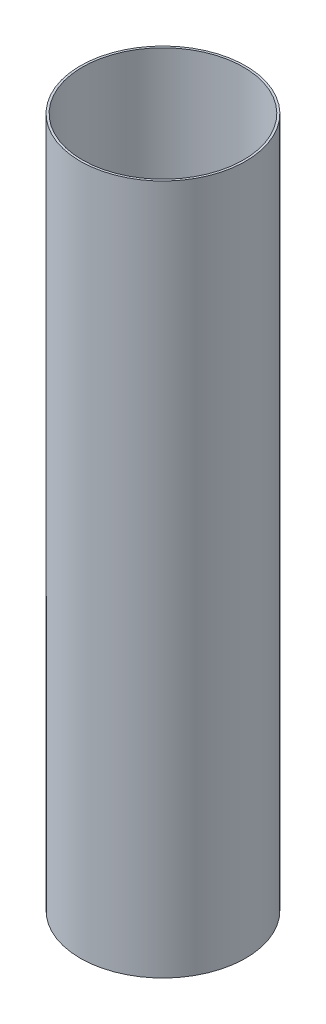
ISO-10303-21;
HEADER;
FILE_DESCRIPTION(('STEP AP214'),'2;1');
FILE_NAME('part.step','',(''),(''),'','','');
FILE_SCHEMA(('AUTOMOTIVE_DESIGN { 1 0 10303 214 1 1 1 1 }'));
ENDSEC;
DATA;
#1=APPLICATION_CONTEXT('core data for automotive mechanical design processes');
#2=APPLICATION_PROTOCOL_DEFINITION('international standard','automotive_design',2000,#1);
#3=PRODUCT_CONTEXT('',#1,'mechanical');
#4=PRODUCT('Part','Part','',(#3));
#5=PRODUCT_RELATED_PRODUCT_CATEGORY('part','',(#4));
#6=PRODUCT_DEFINITION_FORMATION('','',#4);
#7=PRODUCT_DEFINITION_CONTEXT('part definition',#1,'design');
#8=PRODUCT_DEFINITION('design','',#6,#7);
#9=PRODUCT_DEFINITION_SHAPE('','',#8);
#10=(LENGTH_UNIT() NAMED_UNIT(*) SI_UNIT(.MILLI.,.METRE.));
#11=(NAMED_UNIT(*) PLANE_ANGLE_UNIT() SI_UNIT($,.RADIAN.));
#12=(NAMED_UNIT(*) SI_UNIT($,.STERADIAN.) SOLID_ANGLE_UNIT());
#13=UNCERTAINTY_MEASURE_WITH_UNIT(LENGTH_MEASURE(1.E-05),#10,'distance_accuracy_value','');
#14=(GEOMETRIC_REPRESENTATION_CONTEXT(3) GLOBAL_UNCERTAINTY_ASSIGNED_CONTEXT((#13)) GLOBAL_UNIT_ASSIGNED_CONTEXT((#10,
#11,#12)) REPRESENTATION_CONTEXT('',''));
#15=CARTESIAN_POINT('',(0.,0.,0.));
#16=DIRECTION('',(0.,0.,1.));
#17=DIRECTION('',(1.,0.,0.));
#18=AXIS2_PLACEMENT_3D('',#15,#16,#17);
#19=CARTESIAN_POINT('',(0.,9144.,0.));
#20=DIRECTION('',(0.,1.,0.));
#21=DIRECTION('',(0.,0.,1.));
#22=AXIS2_PLACEMENT_3D('',#19,#20,#21);
#23=PLANE('',#22);
#24=CARTESIAN_POINT('',(0.,9144.,0.));
#25=DIRECTION('',(0.,1.,0.));
#26=DIRECTION('',(0.,0.,1.));
#27=AXIS2_PLACEMENT_3D('',#24,#25,#26);
#28=CIRCLE('',#27,1095.375);
#29=CARTESIAN_POINT('',(0.,9144.,1095.375));
#30=VERTEX_POINT('',#29);
#31=EDGE_CURVE('E10',#30,#30,#28,.T.);
#32=ORIENTED_EDGE('',*,*,#31,.T.);
#33=EDGE_LOOP('',(#32));
#34=FACE_BOUND('',#33,.T.);
#35=CARTESIAN_POINT('',(0.,9144.,0.));
#36=DIRECTION('',(0.,1.,0.));
#37=DIRECTION('',(0.,0.,1.));
#38=AXIS2_PLACEMENT_3D('',#35,#36,#37);
#39=CIRCLE('',#38,1066.8);
#40=CARTESIAN_POINT('',(0.,9144.,1066.8));
#41=VERTEX_POINT('',#40);
#42=EDGE_CURVE('E48',#41,#41,#39,.T.);
#43=ORIENTED_EDGE('',*,*,#42,.F.);
#44=EDGE_LOOP('',(#43));
#45=FACE_BOUND('',#44,.T.);
#46=ADVANCED_FACE('F37',(#34,#45),#23,.T.);
#47=CARTESIAN_POINT('',(0.,0.,0.));
#48=DIRECTION('',(0.,1.,0.));
#49=DIRECTION('',(0.,0.,1.));
#50=AXIS2_PLACEMENT_3D('',#47,#48,#49);
#51=PLANE('',#50);
#52=CARTESIAN_POINT('',(0.,0.,0.));
#53=DIRECTION('',(0.,1.,0.));
#54=DIRECTION('',(0.,0.,1.));
#55=AXIS2_PLACEMENT_3D('',#52,#53,#54);
#56=CIRCLE('',#55,1095.375);
#57=CARTESIAN_POINT('',(0.,0.,1095.375));
#58=VERTEX_POINT('',#57);
#59=EDGE_CURVE('E41',#58,#58,#56,.T.);
#60=ORIENTED_EDGE('',*,*,#59,.F.);
#61=EDGE_LOOP('',(#60));
#62=FACE_BOUND('',#61,.T.);
#63=CARTESIAN_POINT('',(0.,0.,0.));
#64=DIRECTION('',(0.,1.,0.));
#65=DIRECTION('',(0.,0.,1.));
#66=AXIS2_PLACEMENT_3D('',#63,#64,#65);
#67=CIRCLE('',#66,1066.8);
#68=CARTESIAN_POINT('',(0.,0.,1066.8));
#69=VERTEX_POINT('',#68);
#70=EDGE_CURVE('E50',#69,#69,#67,.T.);
#71=ORIENTED_EDGE('',*,*,#70,.T.);
#72=EDGE_LOOP('',(#71));
#73=FACE_BOUND('',#72,.T.);
#74=ADVANCED_FACE('F60',(#62,#73),#51,.F.);
#75=CARTESIAN_POINT('',(0.,9144.,0.));
#76=DIRECTION('',(0.,-1.,0.));
#77=DIRECTION('',(0.,0.,-1.));
#78=AXIS2_PLACEMENT_3D('',#75,#76,#77);
#79=CYLINDRICAL_SURFACE('',#78,1095.375);
#80=ORIENTED_EDGE('',*,*,#31,.F.);
#81=EDGE_LOOP('',(#80));
#82=FACE_BOUND('',#81,.T.);
#83=ORIENTED_EDGE('',*,*,#59,.T.);
#84=EDGE_LOOP('',(#83));
#85=FACE_BOUND('',#84,.T.);
#86=ADVANCED_FACE('F39',(#82,#85),#79,.T.);
#87=CARTESIAN_POINT('',(0.,9144.,0.));
#88=DIRECTION('',(0.,-1.,0.));
#89=DIRECTION('',(0.,0.,-1.));
#90=AXIS2_PLACEMENT_3D('',#87,#88,#89);
#91=CYLINDRICAL_SURFACE('',#90,1066.8);
#92=ORIENTED_EDGE('',*,*,#42,.T.);
#93=EDGE_LOOP('',(#92));
#94=FACE_BOUND('',#93,.T.);
#95=ORIENTED_EDGE('',*,*,#70,.F.);
#96=EDGE_LOOP('',(#95));
#97=FACE_BOUND('',#96,.T.);
#98=ADVANCED_FACE('F56',(#94,#97),#91,.F.);
#99=CLOSED_SHELL('',(#46,#74,#86,#98));
#100=MANIFOLD_SOLID_BREP('B2',#99);
#101=ADVANCED_BREP_SHAPE_REPRESENTATION('',(#18,#100),#14);
#102=SHAPE_DEFINITION_REPRESENTATION(#9,#101);
ENDSEC;
END-ISO-10303-21;
